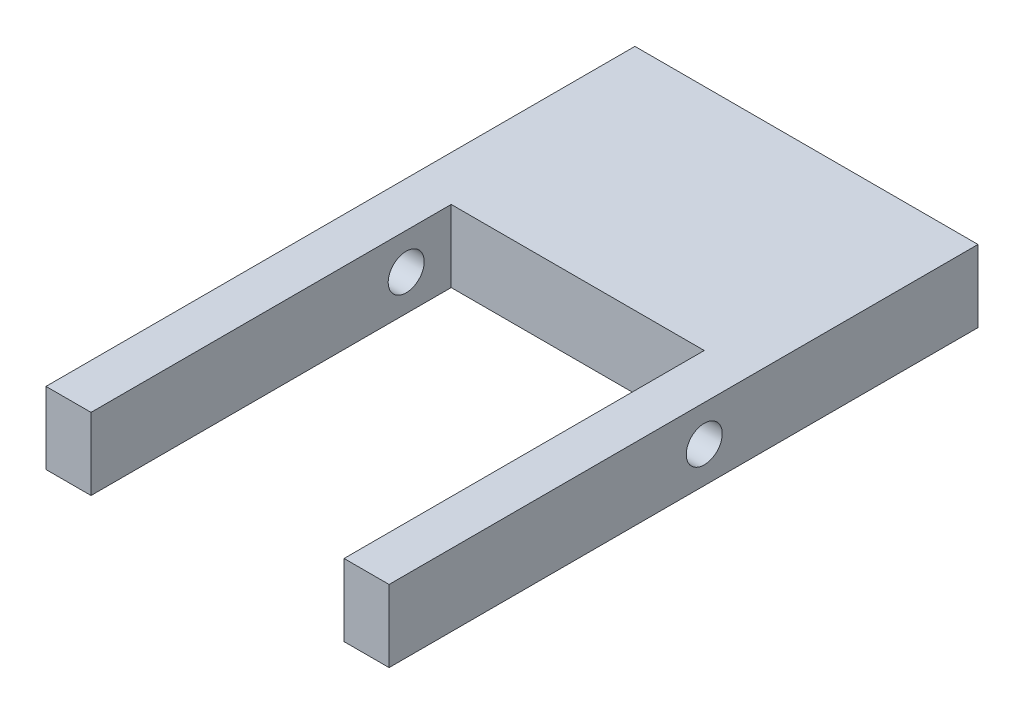
ISO-10303-21;
HEADER;
FILE_DESCRIPTION(('STEP AP214'),'2;1');
FILE_NAME('part.step','',(''),(''),'','','');
FILE_SCHEMA(('AUTOMOTIVE_DESIGN { 1 0 10303 214 1 1 1 1 }'));
ENDSEC;
DATA;
#1=APPLICATION_CONTEXT('core data for automotive mechanical design processes');
#2=APPLICATION_PROTOCOL_DEFINITION('international standard','automotive_design',2000,#1);
#3=PRODUCT_CONTEXT('',#1,'mechanical');
#4=PRODUCT('Part','Part','',(#3));
#5=PRODUCT_RELATED_PRODUCT_CATEGORY('part','',(#4));
#6=PRODUCT_DEFINITION_FORMATION('','',#4);
#7=PRODUCT_DEFINITION_CONTEXT('part definition',#1,'design');
#8=PRODUCT_DEFINITION('design','',#6,#7);
#9=PRODUCT_DEFINITION_SHAPE('','',#8);
#10=(LENGTH_UNIT() NAMED_UNIT(*) SI_UNIT(.MILLI.,.METRE.));
#11=(NAMED_UNIT(*) PLANE_ANGLE_UNIT() SI_UNIT($,.RADIAN.));
#12=(NAMED_UNIT(*) SI_UNIT($,.STERADIAN.) SOLID_ANGLE_UNIT());
#13=UNCERTAINTY_MEASURE_WITH_UNIT(LENGTH_MEASURE(1.E-05),#10,'distance_accuracy_value','');
#14=(GEOMETRIC_REPRESENTATION_CONTEXT(3) GLOBAL_UNCERTAINTY_ASSIGNED_CONTEXT((#13)) GLOBAL_UNIT_ASSIGNED_CONTEXT((#10,
#11,#12)) REPRESENTATION_CONTEXT('',''));
#15=CARTESIAN_POINT('',(0.,0.,0.));
#16=DIRECTION('',(0.,0.,1.));
#17=DIRECTION('',(1.,0.,0.));
#18=AXIS2_PLACEMENT_3D('',#15,#16,#17);
#19=CARTESIAN_POINT('',(0.,8.,0.));
#20=DIRECTION('',(0.,0.,-1.));
#21=DIRECTION('',(-1.,0.,0.));
#22=AXIS2_PLACEMENT_3D('',#19,#20,#21);
#23=PLANE('',#22);
#24=DIRECTION('',(0.,1.,0.));
#25=VECTOR('',#24,1.);
#26=CARTESIAN_POINT('',(5.,0.,0.));
#27=LINE('',#26,#25);
#28=CARTESIAN_POINT('',(5.,0.,0.));
#29=VERTEX_POINT('',#28);
#30=CARTESIAN_POINT('',(5.,8.,0.));
#31=VERTEX_POINT('',#30);
#32=EDGE_CURVE('E116',#29,#31,#27,.T.);
#33=ORIENTED_EDGE('',*,*,#32,.F.);
#34=DIRECTION('',(1.,0.,0.));
#35=VECTOR('',#34,1.);
#36=CARTESIAN_POINT('',(0.,0.,0.));
#37=LINE('',#36,#35);
#38=CARTESIAN_POINT('',(33.1,0.,0.));
#39=VERTEX_POINT('',#38);
#40=EDGE_CURVE('E158',#29,#39,#37,.T.);
#41=ORIENTED_EDGE('',*,*,#40,.T.);
#42=DIRECTION('',(0.,-1.,0.));
#43=VECTOR('',#42,1.);
#44=CARTESIAN_POINT('',(33.1,0.,0.));
#45=LINE('',#44,#43);
#46=CARTESIAN_POINT('',(33.1,8.,0.));
#47=VERTEX_POINT('',#46);
#48=EDGE_CURVE('E130',#47,#39,#45,.T.);
#49=ORIENTED_EDGE('',*,*,#48,.F.);
#50=DIRECTION('',(1.,0.,0.));
#51=VECTOR('',#50,1.);
#52=CARTESIAN_POINT('',(0.,8.,0.));
#53=LINE('',#52,#51);
#54=EDGE_CURVE('E48',#31,#47,#53,.T.);
#55=ORIENTED_EDGE('',*,*,#54,.F.);
#56=EDGE_LOOP('',(#33,#41,#49,#55));
#57=FACE_BOUND('',#56,.T.);
#58=ADVANCED_FACE('F32',(#57),#23,.F.);
#59=CARTESIAN_POINT('',(0.,8.,0.));
#60=DIRECTION('',(1.,0.,0.));
#61=DIRECTION('',(0.,0.,-1.));
#62=AXIS2_PLACEMENT_3D('',#59,#60,#61);
#63=PLANE('',#62);
#64=CARTESIAN_POINT('',(0.,4.,5.));
#65=DIRECTION('',(-1.,0.,0.));
#66=DIRECTION('',(0.,0.,1.));
#67=AXIS2_PLACEMENT_3D('',#64,#65,#66);
#68=CIRCLE('',#67,2.);
#69=CARTESIAN_POINT('',(0.,4.,7.));
#70=VERTEX_POINT('',#69);
#71=EDGE_CURVE('E175',#70,#70,#68,.T.);
#72=ORIENTED_EDGE('',*,*,#71,.F.);
#73=EDGE_LOOP('',(#72));
#74=FACE_BOUND('',#73,.T.);
#75=DIRECTION('',(0.,0.,1.));
#76=VECTOR('',#75,1.);
#77=CARTESIAN_POINT('',(0.,0.,0.));
#78=LINE('',#77,#76);
#79=CARTESIAN_POINT('',(0.,0.,-25.4));
#80=VERTEX_POINT('',#79);
#81=CARTESIAN_POINT('',(0.,0.,40.));
#82=VERTEX_POINT('',#81);
#83=EDGE_CURVE('E149',#80,#82,#78,.T.);
#84=ORIENTED_EDGE('',*,*,#83,.T.);
#85=DIRECTION('',(0.,-1.,0.));
#86=VECTOR('',#85,1.);
#87=CARTESIAN_POINT('',(0.,0.,40.));
#88=LINE('',#87,#86);
#89=CARTESIAN_POINT('',(0.,8.,40.));
#90=VERTEX_POINT('',#89);
#91=EDGE_CURVE('E106',#90,#82,#88,.T.);
#92=ORIENTED_EDGE('',*,*,#91,.F.);
#93=DIRECTION('',(0.,0.,1.));
#94=VECTOR('',#93,1.);
#95=CARTESIAN_POINT('',(0.,8.,0.));
#96=LINE('',#95,#94);
#97=CARTESIAN_POINT('',(0.,8.,-25.4));
#98=VERTEX_POINT('',#97);
#99=EDGE_CURVE('E102',#98,#90,#96,.T.);
#100=ORIENTED_EDGE('',*,*,#99,.F.);
#101=DIRECTION('',(0.,-1.,0.));
#102=VECTOR('',#101,1.);
#103=CARTESIAN_POINT('',(0.,8.,-25.4));
#104=LINE('',#103,#102);
#105=EDGE_CURVE('E41',#98,#80,#104,.T.);
#106=ORIENTED_EDGE('',*,*,#105,.T.);
#107=EDGE_LOOP('',(#84,#92,#100,#106));
#108=FACE_BOUND('',#107,.T.);
#109=ADVANCED_FACE('F34',(#74,#108),#63,.F.);
#110=CARTESIAN_POINT('',(38.1,8.,0.));
#111=DIRECTION('',(-1.,0.,0.));
#112=DIRECTION('',(0.,0.,1.));
#113=AXIS2_PLACEMENT_3D('',#110,#111,#112);
#114=PLANE('',#113);
#115=CARTESIAN_POINT('',(38.1,4.,5.));
#116=DIRECTION('',(-1.,0.,0.));
#117=DIRECTION('',(0.,0.,1.));
#118=AXIS2_PLACEMENT_3D('',#115,#116,#117);
#119=CIRCLE('',#118,2.);
#120=CARTESIAN_POINT('',(38.1,4.,7.));
#121=VERTEX_POINT('',#120);
#122=EDGE_CURVE('E123',#121,#121,#119,.T.);
#123=ORIENTED_EDGE('',*,*,#122,.T.);
#124=EDGE_LOOP('',(#123));
#125=FACE_BOUND('',#124,.T.);
#126=DIRECTION('',(0.,0.,-1.));
#127=VECTOR('',#126,1.);
#128=CARTESIAN_POINT('',(38.1,0.,0.));
#129=LINE('',#128,#127);
#130=CARTESIAN_POINT('',(38.1,0.,40.));
#131=VERTEX_POINT('',#130);
#132=CARTESIAN_POINT('',(38.1,0.,-25.4));
#133=VERTEX_POINT('',#132);
#134=EDGE_CURVE('E160',#131,#133,#129,.T.);
#135=ORIENTED_EDGE('',*,*,#134,.T.);
#136=DIRECTION('',(0.,-1.,0.));
#137=VECTOR('',#136,1.);
#138=CARTESIAN_POINT('',(38.1,8.,-25.4));
#139=LINE('',#138,#137);
#140=CARTESIAN_POINT('',(38.1,8.,-25.4));
#141=VERTEX_POINT('',#140);
#142=EDGE_CURVE('E11',#141,#133,#139,.T.);
#143=ORIENTED_EDGE('',*,*,#142,.F.);
#144=DIRECTION('',(0.,0.,-1.));
#145=VECTOR('',#144,1.);
#146=CARTESIAN_POINT('',(38.1,8.,0.));
#147=LINE('',#146,#145);
#148=CARTESIAN_POINT('',(38.1,8.,40.));
#149=VERTEX_POINT('',#148);
#150=EDGE_CURVE('E153',#149,#141,#147,.T.);
#151=ORIENTED_EDGE('',*,*,#150,.F.);
#152=DIRECTION('',(0.,1.,0.));
#153=VECTOR('',#152,1.);
#154=CARTESIAN_POINT('',(38.1,0.,40.));
#155=LINE('',#154,#153);
#156=EDGE_CURVE('E131',#131,#149,#155,.T.);
#157=ORIENTED_EDGE('',*,*,#156,.F.);
#158=EDGE_LOOP('',(#135,#143,#151,#157));
#159=FACE_BOUND('',#158,.T.);
#160=ADVANCED_FACE('F186',(#125,#159),#114,.F.);
#161=CARTESIAN_POINT('',(0.,8.,-25.4));
#162=DIRECTION('',(0.,0.,1.));
#163=DIRECTION('',(1.,0.,0.));
#164=AXIS2_PLACEMENT_3D('',#161,#162,#163);
#165=PLANE('',#164);
#166=DIRECTION('',(-1.,0.,0.));
#167=VECTOR('',#166,1.);
#168=CARTESIAN_POINT('',(0.,0.,-25.4));
#169=LINE('',#168,#167);
#170=EDGE_CURVE('E151',#133,#80,#169,.T.);
#171=ORIENTED_EDGE('',*,*,#170,.T.);
#172=ORIENTED_EDGE('',*,*,#105,.F.);
#173=DIRECTION('',(-1.,0.,0.));
#174=VECTOR('',#173,1.);
#175=CARTESIAN_POINT('',(0.,8.,-25.4));
#176=LINE('',#175,#174);
#177=EDGE_CURVE('E155',#141,#98,#176,.T.);
#178=ORIENTED_EDGE('',*,*,#177,.F.);
#179=ORIENTED_EDGE('',*,*,#142,.T.);
#180=EDGE_LOOP('',(#171,#172,#178,#179));
#181=FACE_BOUND('',#180,.T.);
#182=ADVANCED_FACE('F191',(#181),#165,.F.);
#183=CARTESIAN_POINT('',(0.,8.,0.));
#184=DIRECTION('',(0.,-1.,0.));
#185=DIRECTION('',(0.,0.,-1.));
#186=AXIS2_PLACEMENT_3D('',#183,#184,#185);
#187=PLANE('',#186);
#188=ORIENTED_EDGE('',*,*,#99,.T.);
#189=DIRECTION('',(-1.,0.,0.));
#190=VECTOR('',#189,1.);
#191=CARTESIAN_POINT('',(5.,8.,40.));
#192=LINE('',#191,#190);
#193=CARTESIAN_POINT('',(5.,8.,40.));
#194=VERTEX_POINT('',#193);
#195=EDGE_CURVE('E95',#194,#90,#192,.T.);
#196=ORIENTED_EDGE('',*,*,#195,.F.);
#197=DIRECTION('',(0.,0.,-1.));
#198=VECTOR('',#197,1.);
#199=CARTESIAN_POINT('',(5.,8.,40.));
#200=LINE('',#199,#198);
#201=EDGE_CURVE('E99',#194,#31,#200,.T.);
#202=ORIENTED_EDGE('',*,*,#201,.T.);
#203=ORIENTED_EDGE('',*,*,#54,.T.);
#204=DIRECTION('',(0.,0.,-1.));
#205=VECTOR('',#204,1.);
#206=CARTESIAN_POINT('',(33.1,8.,40.));
#207=LINE('',#206,#205);
#208=CARTESIAN_POINT('',(33.1,8.,40.));
#209=VERTEX_POINT('',#208);
#210=EDGE_CURVE('E146',#209,#47,#207,.T.);
#211=ORIENTED_EDGE('',*,*,#210,.F.);
#212=DIRECTION('',(-1.,0.,0.));
#213=VECTOR('',#212,1.);
#214=CARTESIAN_POINT('',(38.1,8.,40.));
#215=LINE('',#214,#213);
#216=EDGE_CURVE('E134',#149,#209,#215,.T.);
#217=ORIENTED_EDGE('',*,*,#216,.F.);
#218=ORIENTED_EDGE('',*,*,#150,.T.);
#219=ORIENTED_EDGE('',*,*,#177,.T.);
#220=EDGE_LOOP('',(#188,#196,#202,#203,#211,#217,#218,#219));
#221=FACE_BOUND('',#220,.T.);
#222=ADVANCED_FACE('F97',(#221),#187,.F.);
#223=CARTESIAN_POINT('',(0.,0.,0.));
#224=DIRECTION('',(0.,-1.,0.));
#225=DIRECTION('',(0.,0.,-1.));
#226=AXIS2_PLACEMENT_3D('',#223,#224,#225);
#227=PLANE('',#226);
#228=ORIENTED_EDGE('',*,*,#83,.F.);
#229=ORIENTED_EDGE('',*,*,#170,.F.);
#230=ORIENTED_EDGE('',*,*,#134,.F.);
#231=DIRECTION('',(1.,0.,0.));
#232=VECTOR('',#231,1.);
#233=CARTESIAN_POINT('',(38.1,0.,40.));
#234=LINE('',#233,#232);
#235=CARTESIAN_POINT('',(33.1,0.,40.));
#236=VERTEX_POINT('',#235);
#237=EDGE_CURVE('E138',#236,#131,#234,.T.);
#238=ORIENTED_EDGE('',*,*,#237,.F.);
#239=DIRECTION('',(0.,0.,-1.));
#240=VECTOR('',#239,1.);
#241=CARTESIAN_POINT('',(33.1,0.,40.));
#242=LINE('',#241,#240);
#243=EDGE_CURVE('E141',#236,#39,#242,.T.);
#244=ORIENTED_EDGE('',*,*,#243,.T.);
#245=ORIENTED_EDGE('',*,*,#40,.F.);
#246=DIRECTION('',(0.,0.,-1.));
#247=VECTOR('',#246,1.);
#248=CARTESIAN_POINT('',(5.,0.,40.));
#249=LINE('',#248,#247);
#250=CARTESIAN_POINT('',(5.,0.,40.));
#251=VERTEX_POINT('',#250);
#252=EDGE_CURVE('E120',#251,#29,#249,.T.);
#253=ORIENTED_EDGE('',*,*,#252,.F.);
#254=DIRECTION('',(1.,0.,0.));
#255=VECTOR('',#254,1.);
#256=CARTESIAN_POINT('',(5.,0.,40.));
#257=LINE('',#256,#255);
#258=EDGE_CURVE('E112',#82,#251,#257,.T.);
#259=ORIENTED_EDGE('',*,*,#258,.F.);
#260=EDGE_LOOP('',(#228,#229,#230,#238,#244,#245,#253,#259));
#261=FACE_BOUND('',#260,.T.);
#262=ADVANCED_FACE('F171',(#261),#227,.T.);
#263=CARTESIAN_POINT('',(33.1,0.,40.));
#264=DIRECTION('',(1.,0.,0.));
#265=DIRECTION('',(0.,0.,-1.));
#266=AXIS2_PLACEMENT_3D('',#263,#264,#265);
#267=PLANE('',#266);
#268=CARTESIAN_POINT('',(33.1,4.,5.));
#269=DIRECTION('',(-1.,0.,0.));
#270=DIRECTION('',(0.,0.,1.));
#271=AXIS2_PLACEMENT_3D('',#268,#269,#270);
#272=CIRCLE('',#271,2.);
#273=CARTESIAN_POINT('',(33.1,4.,7.));
#274=VERTEX_POINT('',#273);
#275=EDGE_CURVE('E119',#274,#274,#272,.T.);
#276=ORIENTED_EDGE('',*,*,#275,.F.);
#277=EDGE_LOOP('',(#276));
#278=FACE_BOUND('',#277,.T.);
#279=ORIENTED_EDGE('',*,*,#48,.T.);
#280=ORIENTED_EDGE('',*,*,#243,.F.);
#281=DIRECTION('',(0.,-1.,0.));
#282=VECTOR('',#281,1.);
#283=CARTESIAN_POINT('',(33.1,0.,40.));
#284=LINE('',#283,#282);
#285=EDGE_CURVE('E136',#209,#236,#284,.T.);
#286=ORIENTED_EDGE('',*,*,#285,.F.);
#287=ORIENTED_EDGE('',*,*,#210,.T.);
#288=EDGE_LOOP('',(#279,#280,#286,#287));
#289=FACE_BOUND('',#288,.T.);
#290=ADVANCED_FACE('F201',(#278,#289),#267,.F.);
#291=CARTESIAN_POINT('',(0.,0.,40.));
#292=DIRECTION('',(0.,0.,1.));
#293=DIRECTION('',(1.,0.,0.));
#294=AXIS2_PLACEMENT_3D('',#291,#292,#293);
#295=PLANE('',#294);
#296=ORIENTED_EDGE('',*,*,#156,.T.);
#297=ORIENTED_EDGE('',*,*,#216,.T.);
#298=ORIENTED_EDGE('',*,*,#285,.T.);
#299=ORIENTED_EDGE('',*,*,#237,.T.);
#300=EDGE_LOOP('',(#296,#297,#298,#299));
#301=FACE_BOUND('',#300,.T.);
#302=ADVANCED_FACE('F206',(#301),#295,.T.);
#303=CARTESIAN_POINT('',(63.1,4.,5.));
#304=DIRECTION('',(-1.,0.,0.));
#305=DIRECTION('',(0.,0.,1.));
#306=AXIS2_PLACEMENT_3D('',#303,#304,#305);
#307=CYLINDRICAL_SURFACE('',#306,2.);
#308=ORIENTED_EDGE('',*,*,#275,.T.);
#309=EDGE_LOOP('',(#308));
#310=FACE_BOUND('',#309,.T.);
#311=ORIENTED_EDGE('',*,*,#122,.F.);
#312=EDGE_LOOP('',(#311));
#313=FACE_BOUND('',#312,.T.);
#314=ADVANCED_FACE('F210',(#310,#313),#307,.F.);
#315=CARTESIAN_POINT('',(5.,0.,40.));
#316=DIRECTION('',(-1.,0.,0.));
#317=DIRECTION('',(0.,0.,1.));
#318=AXIS2_PLACEMENT_3D('',#315,#316,#317);
#319=PLANE('',#318);
#320=CARTESIAN_POINT('',(5.,4.,5.));
#321=DIRECTION('',(-1.,0.,0.));
#322=DIRECTION('',(0.,0.,1.));
#323=AXIS2_PLACEMENT_3D('',#320,#321,#322);
#324=CIRCLE('',#323,2.);
#325=CARTESIAN_POINT('',(5.,4.,7.));
#326=VERTEX_POINT('',#325);
#327=EDGE_CURVE('E36',#326,#326,#324,.T.);
#328=ORIENTED_EDGE('',*,*,#327,.T.);
#329=EDGE_LOOP('',(#328));
#330=FACE_BOUND('',#329,.T.);
#331=ORIENTED_EDGE('',*,*,#32,.T.);
#332=ORIENTED_EDGE('',*,*,#201,.F.);
#333=DIRECTION('',(0.,1.,0.));
#334=VECTOR('',#333,1.);
#335=CARTESIAN_POINT('',(5.,0.,40.));
#336=LINE('',#335,#334);
#337=EDGE_CURVE('E107',#251,#194,#336,.T.);
#338=ORIENTED_EDGE('',*,*,#337,.F.);
#339=ORIENTED_EDGE('',*,*,#252,.T.);
#340=EDGE_LOOP('',(#331,#332,#338,#339));
#341=FACE_BOUND('',#340,.T.);
#342=ADVANCED_FACE('F118',(#330,#341),#319,.F.);
#343=CARTESIAN_POINT('',(-33.1,0.,40.));
#344=DIRECTION('',(0.,0.,1.));
#345=DIRECTION('',(1.,0.,0.));
#346=AXIS2_PLACEMENT_3D('',#343,#344,#345);
#347=PLANE('',#346);
#348=ORIENTED_EDGE('',*,*,#337,.T.);
#349=ORIENTED_EDGE('',*,*,#195,.T.);
#350=ORIENTED_EDGE('',*,*,#91,.T.);
#351=ORIENTED_EDGE('',*,*,#258,.T.);
#352=EDGE_LOOP('',(#348,#349,#350,#351));
#353=FACE_BOUND('',#352,.T.);
#354=ADVANCED_FACE('F110',(#353),#347,.T.);
#355=CARTESIAN_POINT('',(30.,4.,5.));
#356=DIRECTION('',(-1.,0.,0.));
#357=DIRECTION('',(0.,0.,1.));
#358=AXIS2_PLACEMENT_3D('',#355,#356,#357);
#359=CYLINDRICAL_SURFACE('',#358,2.);
#360=ORIENTED_EDGE('',*,*,#71,.T.);
#361=EDGE_LOOP('',(#360));
#362=FACE_BOUND('',#361,.T.);
#363=ORIENTED_EDGE('',*,*,#327,.F.);
#364=EDGE_LOOP('',(#363));
#365=FACE_BOUND('',#364,.T.);
#366=ADVANCED_FACE('F182',(#362,#365),#359,.F.);
#367=CLOSED_SHELL('',(#58,#109,#160,#182,#222,#262,#290,#302,#314,#342,#354,#366));
#368=MANIFOLD_SOLID_BREP('B2',#367);
#369=ADVANCED_BREP_SHAPE_REPRESENTATION('',(#18,#368),#14);
#370=SHAPE_DEFINITION_REPRESENTATION(#9,#369);
ENDSEC;
END-ISO-10303-21;
